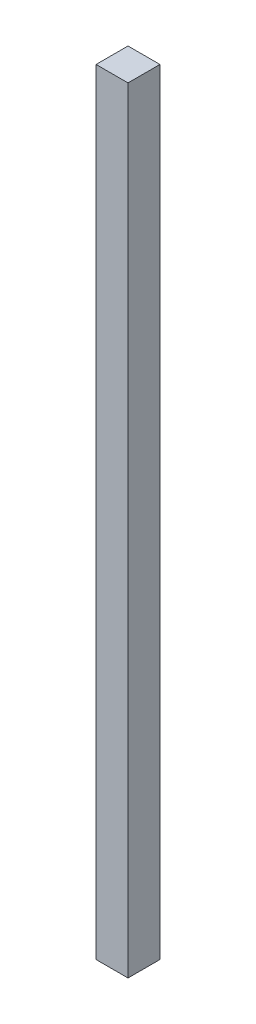
ISO-10303-21;
HEADER;
FILE_DESCRIPTION(('STEP AP214'),'2;1');
FILE_NAME('part.step','',(''),(''),'','','');
FILE_SCHEMA(('AUTOMOTIVE_DESIGN { 1 0 10303 214 1 1 1 1 }'));
ENDSEC;
DATA;
#1=APPLICATION_CONTEXT('core data for automotive mechanical design processes');
#2=APPLICATION_PROTOCOL_DEFINITION('international standard','automotive_design',2000,#1);
#3=PRODUCT_CONTEXT('',#1,'mechanical');
#4=PRODUCT('Part','Part','',(#3));
#5=PRODUCT_RELATED_PRODUCT_CATEGORY('part','',(#4));
#6=PRODUCT_DEFINITION_FORMATION('','',#4);
#7=PRODUCT_DEFINITION_CONTEXT('part definition',#1,'design');
#8=PRODUCT_DEFINITION('design','',#6,#7);
#9=PRODUCT_DEFINITION_SHAPE('','',#8);
#10=(LENGTH_UNIT() NAMED_UNIT(*) SI_UNIT(.MILLI.,.METRE.));
#11=(NAMED_UNIT(*) PLANE_ANGLE_UNIT() SI_UNIT($,.RADIAN.));
#12=(NAMED_UNIT(*) SI_UNIT($,.STERADIAN.) SOLID_ANGLE_UNIT());
#13=UNCERTAINTY_MEASURE_WITH_UNIT(LENGTH_MEASURE(1.E-05),#10,'distance_accuracy_value','');
#14=(GEOMETRIC_REPRESENTATION_CONTEXT(3) GLOBAL_UNCERTAINTY_ASSIGNED_CONTEXT((#13)) GLOBAL_UNIT_ASSIGNED_CONTEXT((#10,
#11,#12)) REPRESENTATION_CONTEXT('',''));
#15=CARTESIAN_POINT('',(0.,0.,0.));
#16=DIRECTION('',(0.,0.,1.));
#17=DIRECTION('',(1.,0.,0.));
#18=AXIS2_PLACEMENT_3D('',#15,#16,#17);
#19=CARTESIAN_POINT('',(15.,728.,15.));
#20=DIRECTION('',(-1.,0.,0.));
#21=DIRECTION('',(0.,0.,1.));
#22=AXIS2_PLACEMENT_3D('',#19,#20,#21);
#23=PLANE('',#22);
#24=DIRECTION('',(0.,0.,-1.));
#25=VECTOR('',#24,1.);
#26=CARTESIAN_POINT('',(15.,0.,15.));
#27=LINE('',#26,#25);
#28=CARTESIAN_POINT('',(15.,0.,15.));
#29=VERTEX_POINT('',#28);
#30=CARTESIAN_POINT('',(15.,0.,-15.));
#31=VERTEX_POINT('',#30);
#32=EDGE_CURVE('E107',#29,#31,#27,.T.);
#33=ORIENTED_EDGE('',*,*,#32,.T.);
#34=DIRECTION('',(0.,-1.,0.));
#35=VECTOR('',#34,1.);
#36=CARTESIAN_POINT('',(15.,728.,-15.));
#37=LINE('',#36,#35);
#38=CARTESIAN_POINT('',(15.,728.,-15.));
#39=VERTEX_POINT('',#38);
#40=EDGE_CURVE('E11',#39,#31,#37,.T.);
#41=ORIENTED_EDGE('',*,*,#40,.F.);
#42=DIRECTION('',(0.,0.,-1.));
#43=VECTOR('',#42,1.);
#44=CARTESIAN_POINT('',(15.,728.,15.));
#45=LINE('',#44,#43);
#46=CARTESIAN_POINT('',(15.,728.,15.));
#47=VERTEX_POINT('',#46);
#48=EDGE_CURVE('E91',#47,#39,#45,.T.);
#49=ORIENTED_EDGE('',*,*,#48,.F.);
#50=DIRECTION('',(0.,-1.,0.));
#51=VECTOR('',#50,1.);
#52=CARTESIAN_POINT('',(15.,728.,15.));
#53=LINE('',#52,#51);
#54=EDGE_CURVE('E103',#47,#29,#53,.T.);
#55=ORIENTED_EDGE('',*,*,#54,.T.);
#56=EDGE_LOOP('',(#33,#41,#49,#55));
#57=FACE_BOUND('',#56,.T.);
#58=ADVANCED_FACE('F39',(#57),#23,.F.);
#59=CARTESIAN_POINT('',(-15.,728.,-15.));
#60=DIRECTION('',(0.,0.,1.));
#61=DIRECTION('',(1.,0.,0.));
#62=AXIS2_PLACEMENT_3D('',#59,#60,#61);
#63=PLANE('',#62);
#64=DIRECTION('',(-1.,0.,0.));
#65=VECTOR('',#64,1.);
#66=CARTESIAN_POINT('',(-15.,0.,-15.));
#67=LINE('',#66,#65);
#68=CARTESIAN_POINT('',(-15.,0.,-15.));
#69=VERTEX_POINT('',#68);
#70=EDGE_CURVE('E96',#31,#69,#67,.T.);
#71=ORIENTED_EDGE('',*,*,#70,.T.);
#72=DIRECTION('',(0.,-1.,0.));
#73=VECTOR('',#72,1.);
#74=CARTESIAN_POINT('',(-15.,728.,-15.));
#75=LINE('',#74,#73);
#76=CARTESIAN_POINT('',(-15.,728.,-15.));
#77=VERTEX_POINT('',#76);
#78=EDGE_CURVE('E48',#77,#69,#75,.T.);
#79=ORIENTED_EDGE('',*,*,#78,.F.);
#80=DIRECTION('',(-1.,0.,0.));
#81=VECTOR('',#80,1.);
#82=CARTESIAN_POINT('',(-15.,728.,-15.));
#83=LINE('',#82,#81);
#84=EDGE_CURVE('E86',#39,#77,#83,.T.);
#85=ORIENTED_EDGE('',*,*,#84,.F.);
#86=ORIENTED_EDGE('',*,*,#40,.T.);
#87=EDGE_LOOP('',(#71,#79,#85,#86));
#88=FACE_BOUND('',#87,.T.);
#89=ADVANCED_FACE('F95',(#88),#63,.F.);
#90=CARTESIAN_POINT('',(-15.,728.,15.));
#91=DIRECTION('',(1.,0.,0.));
#92=DIRECTION('',(0.,0.,-1.));
#93=AXIS2_PLACEMENT_3D('',#90,#91,#92);
#94=PLANE('',#93);
#95=DIRECTION('',(0.,0.,1.));
#96=VECTOR('',#95,1.);
#97=CARTESIAN_POINT('',(-15.,0.,15.));
#98=LINE('',#97,#96);
#99=CARTESIAN_POINT('',(-15.,0.,15.));
#100=VERTEX_POINT('',#99);
#101=EDGE_CURVE('E73',#69,#100,#98,.T.);
#102=ORIENTED_EDGE('',*,*,#101,.T.);
#103=DIRECTION('',(0.,-1.,0.));
#104=VECTOR('',#103,1.);
#105=CARTESIAN_POINT('',(-15.,728.,15.));
#106=LINE('',#105,#104);
#107=CARTESIAN_POINT('',(-15.,728.,15.));
#108=VERTEX_POINT('',#107);
#109=EDGE_CURVE('E98',#108,#100,#106,.T.);
#110=ORIENTED_EDGE('',*,*,#109,.F.);
#111=DIRECTION('',(0.,0.,1.));
#112=VECTOR('',#111,1.);
#113=CARTESIAN_POINT('',(-15.,728.,15.));
#114=LINE('',#113,#112);
#115=EDGE_CURVE('E89',#77,#108,#114,.T.);
#116=ORIENTED_EDGE('',*,*,#115,.F.);
#117=ORIENTED_EDGE('',*,*,#78,.T.);
#118=EDGE_LOOP('',(#102,#110,#116,#117));
#119=FACE_BOUND('',#118,.T.);
#120=ADVANCED_FACE('F99',(#119),#94,.F.);
#121=CARTESIAN_POINT('',(-15.,728.,15.));
#122=DIRECTION('',(0.,0.,-1.));
#123=DIRECTION('',(-1.,0.,0.));
#124=AXIS2_PLACEMENT_3D('',#121,#122,#123);
#125=PLANE('',#124);
#126=DIRECTION('',(1.,0.,0.));
#127=VECTOR('',#126,1.);
#128=CARTESIAN_POINT('',(-15.,0.,15.));
#129=LINE('',#128,#127);
#130=EDGE_CURVE('E79',#100,#29,#129,.T.);
#131=ORIENTED_EDGE('',*,*,#130,.T.);
#132=ORIENTED_EDGE('',*,*,#54,.F.);
#133=DIRECTION('',(1.,0.,0.));
#134=VECTOR('',#133,1.);
#135=CARTESIAN_POINT('',(-15.,728.,15.));
#136=LINE('',#135,#134);
#137=EDGE_CURVE('E56',#108,#47,#136,.T.);
#138=ORIENTED_EDGE('',*,*,#137,.F.);
#139=ORIENTED_EDGE('',*,*,#109,.T.);
#140=EDGE_LOOP('',(#131,#132,#138,#139));
#141=FACE_BOUND('',#140,.T.);
#142=ADVANCED_FACE('F120',(#141),#125,.F.);
#143=CARTESIAN_POINT('',(0.,728.,0.));
#144=DIRECTION('',(0.,-1.,0.));
#145=DIRECTION('',(0.,0.,-1.));
#146=AXIS2_PLACEMENT_3D('',#143,#144,#145);
#147=PLANE('',#146);
#148=ORIENTED_EDGE('',*,*,#48,.T.);
#149=ORIENTED_EDGE('',*,*,#84,.T.);
#150=ORIENTED_EDGE('',*,*,#115,.T.);
#151=ORIENTED_EDGE('',*,*,#137,.T.);
#152=EDGE_LOOP('',(#148,#149,#150,#151));
#153=FACE_BOUND('',#152,.T.);
#154=ADVANCED_FACE('F87',(#153),#147,.F.);
#155=CARTESIAN_POINT('',(0.,0.,0.));
#156=DIRECTION('',(0.,-1.,0.));
#157=DIRECTION('',(0.,0.,-1.));
#158=AXIS2_PLACEMENT_3D('',#155,#156,#157);
#159=PLANE('',#158);
#160=ORIENTED_EDGE('',*,*,#32,.F.);
#161=ORIENTED_EDGE('',*,*,#130,.F.);
#162=ORIENTED_EDGE('',*,*,#101,.F.);
#163=ORIENTED_EDGE('',*,*,#70,.F.);
#164=EDGE_LOOP('',(#160,#161,#162,#163));
#165=FACE_BOUND('',#164,.T.);
#166=ADVANCED_FACE('F123',(#165),#159,.T.);
#167=CLOSED_SHELL('',(#58,#89,#120,#142,#154,#166));
#168=MANIFOLD_SOLID_BREP('B2',#167);
#169=ADVANCED_BREP_SHAPE_REPRESENTATION('',(#18,#168),#14);
#170=SHAPE_DEFINITION_REPRESENTATION(#9,#169);
ENDSEC;
END-ISO-10303-21;
